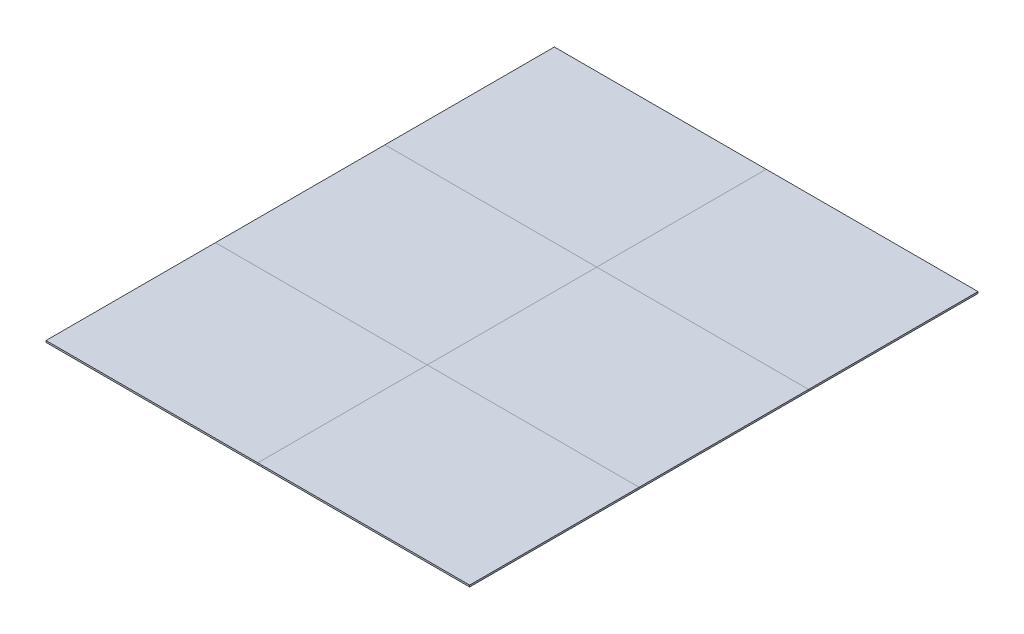
ISO-10303-21;
HEADER;
FILE_DESCRIPTION(('STEP AP214'),'2;1');
FILE_NAME('part.step','',(''),(''),'','','');
FILE_SCHEMA(('AUTOMOTIVE_DESIGN { 1 0 10303 214 1 1 1 1 }'));
ENDSEC;
DATA;
#1=APPLICATION_CONTEXT('core data for automotive mechanical design processes');
#2=APPLICATION_PROTOCOL_DEFINITION('international standard','automotive_design',2000,#1);
#3=PRODUCT_CONTEXT('',#1,'mechanical');
#4=PRODUCT('Part','Part','',(#3));
#5=PRODUCT_RELATED_PRODUCT_CATEGORY('part','',(#4));
#6=PRODUCT_DEFINITION_FORMATION('','',#4);
#7=PRODUCT_DEFINITION_CONTEXT('part definition',#1,'design');
#8=PRODUCT_DEFINITION('design','',#6,#7);
#9=PRODUCT_DEFINITION_SHAPE('','',#8);
#10=(LENGTH_UNIT() NAMED_UNIT(*) SI_UNIT(.MILLI.,.METRE.));
#11=(NAMED_UNIT(*) PLANE_ANGLE_UNIT() SI_UNIT($,.RADIAN.));
#12=(NAMED_UNIT(*) SI_UNIT($,.STERADIAN.) SOLID_ANGLE_UNIT());
#13=UNCERTAINTY_MEASURE_WITH_UNIT(LENGTH_MEASURE(1.E-05),#10,'distance_accuracy_value','');
#14=(GEOMETRIC_REPRESENTATION_CONTEXT(3) GLOBAL_UNCERTAINTY_ASSIGNED_CONTEXT((#13)) GLOBAL_UNIT_ASSIGNED_CONTEXT((#10,
#11,#12)) REPRESENTATION_CONTEXT('',''));
#15=CARTESIAN_POINT('',(0.,0.,0.));
#16=DIRECTION('',(0.,0.,1.));
#17=DIRECTION('',(1.,0.,0.));
#18=AXIS2_PLACEMENT_3D('',#15,#16,#17);
#19=CARTESIAN_POINT('',(2500.,-20.,-4000.));
#20=DIRECTION('',(-1.,0.,0.));
#21=DIRECTION('',(0.,0.,1.));
#22=AXIS2_PLACEMENT_3D('',#19,#20,#21);
#23=PLANE('',#22);
#24=DIRECTION('',(0.,0.,1.));
#25=VECTOR('',#24,1.);
#26=CARTESIAN_POINT('',(2500.,0.,-4000.));
#27=LINE('',#26,#25);
#28=CARTESIAN_POINT('',(2500.,0.,-6000.));
#29=VERTEX_POINT('',#28);
#30=CARTESIAN_POINT('',(2500.,0.,-4000.));
#31=VERTEX_POINT('',#30);
#32=EDGE_CURVE('E110',#29,#31,#27,.T.);
#33=ORIENTED_EDGE('',*,*,#32,.F.);
#34=DIRECTION('',(0.,1.,0.));
#35=VECTOR('',#34,1.);
#36=CARTESIAN_POINT('',(2500.,-20.,-6000.));
#37=LINE('',#36,#35);
#38=CARTESIAN_POINT('',(2500.,-20.,-6000.));
#39=VERTEX_POINT('',#38);
#40=EDGE_CURVE('E12',#39,#29,#37,.T.);
#41=ORIENTED_EDGE('',*,*,#40,.F.);
#42=DIRECTION('',(0.,0.,1.));
#43=VECTOR('',#42,1.);
#44=CARTESIAN_POINT('',(2500.,-20.,-4000.));
#45=LINE('',#44,#43);
#46=CARTESIAN_POINT('',(2500.,-20.,-4000.));
#47=VERTEX_POINT('',#46);
#48=EDGE_CURVE('E104',#39,#47,#45,.T.);
#49=ORIENTED_EDGE('',*,*,#48,.T.);
#50=DIRECTION('',(0.,1.,0.));
#51=VECTOR('',#50,1.);
#52=CARTESIAN_POINT('',(2500.,-20.,-4000.));
#53=LINE('',#52,#51);
#54=EDGE_CURVE('E49',#47,#31,#53,.T.);
#55=ORIENTED_EDGE('',*,*,#54,.T.);
#56=EDGE_LOOP('',(#33,#41,#49,#55));
#57=FACE_BOUND('',#56,.T.);
#58=ADVANCED_FACE('F46',(#57),#23,.T.);
#59=CARTESIAN_POINT('',(2500.,-20.,-6000.));
#60=DIRECTION('',(0.,0.,-1.));
#61=DIRECTION('',(-1.,0.,0.));
#62=AXIS2_PLACEMENT_3D('',#59,#60,#61);
#63=PLANE('',#62);
#64=DIRECTION('',(-1.,0.,0.));
#65=VECTOR('',#64,1.);
#66=CARTESIAN_POINT('',(2500.,0.,-6000.));
#67=LINE('',#66,#65);
#68=CARTESIAN_POINT('',(5000.,0.,-6000.));
#69=VERTEX_POINT('',#68);
#70=EDGE_CURVE('E106',#69,#29,#67,.T.);
#71=ORIENTED_EDGE('',*,*,#70,.F.);
#72=DIRECTION('',(0.,1.,0.));
#73=VECTOR('',#72,1.);
#74=CARTESIAN_POINT('',(5000.,-20.,-6000.));
#75=LINE('',#74,#73);
#76=CARTESIAN_POINT('',(5000.,-20.,-6000.));
#77=VERTEX_POINT('',#76);
#78=EDGE_CURVE('E55',#77,#69,#75,.T.);
#79=ORIENTED_EDGE('',*,*,#78,.F.);
#80=DIRECTION('',(-1.,0.,0.));
#81=VECTOR('',#80,1.);
#82=CARTESIAN_POINT('',(2500.,-20.,-6000.));
#83=LINE('',#82,#81);
#84=EDGE_CURVE('E101',#77,#39,#83,.T.);
#85=ORIENTED_EDGE('',*,*,#84,.T.);
#86=ORIENTED_EDGE('',*,*,#40,.T.);
#87=EDGE_LOOP('',(#71,#79,#85,#86));
#88=FACE_BOUND('',#87,.T.);
#89=ADVANCED_FACE('F120',(#88),#63,.T.);
#90=CARTESIAN_POINT('',(5000.,-20.,-4000.));
#91=DIRECTION('',(1.,0.,0.));
#92=DIRECTION('',(0.,0.,-1.));
#93=AXIS2_PLACEMENT_3D('',#90,#91,#92);
#94=PLANE('',#93);
#95=DIRECTION('',(0.,0.,-1.));
#96=VECTOR('',#95,1.);
#97=CARTESIAN_POINT('',(5000.,0.,-4000.));
#98=LINE('',#97,#96);
#99=CARTESIAN_POINT('',(5000.,0.,-4000.));
#100=VERTEX_POINT('',#99);
#101=EDGE_CURVE('E96',#100,#69,#98,.T.);
#102=ORIENTED_EDGE('',*,*,#101,.F.);
#103=DIRECTION('',(0.,1.,0.));
#104=VECTOR('',#103,1.);
#105=CARTESIAN_POINT('',(5000.,-20.,-4000.));
#106=LINE('',#105,#104);
#107=CARTESIAN_POINT('',(5000.,-20.,-4000.));
#108=VERTEX_POINT('',#107);
#109=EDGE_CURVE('E91',#108,#100,#106,.T.);
#110=ORIENTED_EDGE('',*,*,#109,.F.);
#111=DIRECTION('',(0.,0.,-1.));
#112=VECTOR('',#111,1.);
#113=CARTESIAN_POINT('',(5000.,-20.,-4000.));
#114=LINE('',#113,#112);
#115=EDGE_CURVE('E94',#108,#77,#114,.T.);
#116=ORIENTED_EDGE('',*,*,#115,.T.);
#117=ORIENTED_EDGE('',*,*,#78,.T.);
#118=EDGE_LOOP('',(#102,#110,#116,#117));
#119=FACE_BOUND('',#118,.T.);
#120=ADVANCED_FACE('F93',(#119),#94,.T.);
#121=CARTESIAN_POINT('',(2500.,-20.,-4000.));
#122=DIRECTION('',(0.,0.,1.));
#123=DIRECTION('',(1.,0.,0.));
#124=AXIS2_PLACEMENT_3D('',#121,#122,#123);
#125=PLANE('',#124);
#126=DIRECTION('',(1.,0.,0.));
#127=VECTOR('',#126,1.);
#128=CARTESIAN_POINT('',(2500.,0.,-4000.));
#129=LINE('',#128,#127);
#130=EDGE_CURVE('E113',#31,#100,#129,.T.);
#131=ORIENTED_EDGE('',*,*,#130,.F.);
#132=ORIENTED_EDGE('',*,*,#54,.F.);
#133=DIRECTION('',(1.,0.,0.));
#134=VECTOR('',#133,1.);
#135=CARTESIAN_POINT('',(2500.,-20.,-4000.));
#136=LINE('',#135,#134);
#137=EDGE_CURVE('E100',#47,#108,#136,.T.);
#138=ORIENTED_EDGE('',*,*,#137,.T.);
#139=ORIENTED_EDGE('',*,*,#109,.T.);
#140=EDGE_LOOP('',(#131,#132,#138,#139));
#141=FACE_BOUND('',#140,.T.);
#142=ADVANCED_FACE('F103',(#141),#125,.T.);
#143=CARTESIAN_POINT('',(2500.,-20.,-4000.));
#144=DIRECTION('',(0.,-1.,0.));
#145=DIRECTION('',(0.,0.,-1.));
#146=AXIS2_PLACEMENT_3D('',#143,#144,#145);
#147=PLANE('',#146);
#148=ORIENTED_EDGE('',*,*,#48,.F.);
#149=ORIENTED_EDGE('',*,*,#84,.F.);
#150=ORIENTED_EDGE('',*,*,#115,.F.);
#151=ORIENTED_EDGE('',*,*,#137,.F.);
#152=EDGE_LOOP('',(#148,#149,#150,#151));
#153=FACE_BOUND('',#152,.T.);
#154=ADVANCED_FACE('F99',(#153),#147,.T.);
#155=CARTESIAN_POINT('',(2500.,0.,-4000.));
#156=DIRECTION('',(0.,-1.,0.));
#157=DIRECTION('',(0.,0.,-1.));
#158=AXIS2_PLACEMENT_3D('',#155,#156,#157);
#159=PLANE('',#158);
#160=ORIENTED_EDGE('',*,*,#32,.T.);
#161=ORIENTED_EDGE('',*,*,#130,.T.);
#162=ORIENTED_EDGE('',*,*,#101,.T.);
#163=ORIENTED_EDGE('',*,*,#70,.T.);
#164=EDGE_LOOP('',(#160,#161,#162,#163));
#165=FACE_BOUND('',#164,.T.);
#166=ADVANCED_FACE('F119',(#165),#159,.F.);
#167=CLOSED_SHELL('',(#58,#89,#120,#142,#154,#166));
#168=MANIFOLD_SOLID_BREP('B2',#167);
#169=CARTESIAN_POINT('',(2500.,-20.,-2000.));
#170=DIRECTION('',(-1.,0.,0.));
#171=DIRECTION('',(0.,0.,1.));
#172=AXIS2_PLACEMENT_3D('',#169,#170,#171);
#173=PLANE('',#172);
#174=DIRECTION('',(0.,0.,1.));
#175=VECTOR('',#174,1.);
#176=CARTESIAN_POINT('',(2500.,0.,-2000.));
#177=LINE('',#176,#175);
#178=CARTESIAN_POINT('',(2500.,0.,-4000.));
#179=VERTEX_POINT('',#178);
#180=CARTESIAN_POINT('',(2500.,0.,-2000.));
#181=VERTEX_POINT('',#180);
#182=EDGE_CURVE('E244',#179,#181,#177,.T.);
#183=ORIENTED_EDGE('',*,*,#182,.F.);
#184=DIRECTION('',(0.,1.,0.));
#185=VECTOR('',#184,1.);
#186=CARTESIAN_POINT('',(2500.,-20.,-4000.));
#187=LINE('',#186,#185);
#188=CARTESIAN_POINT('',(2500.,-20.,-4000.));
#189=VERTEX_POINT('',#188);
#190=EDGE_CURVE('E44',#189,#179,#187,.T.);
#191=ORIENTED_EDGE('',*,*,#190,.F.);
#192=DIRECTION('',(0.,0.,1.));
#193=VECTOR('',#192,1.);
#194=CARTESIAN_POINT('',(2500.,-20.,-2000.));
#195=LINE('',#194,#193);
#196=CARTESIAN_POINT('',(2500.,-20.,-2000.));
#197=VERTEX_POINT('',#196);
#198=EDGE_CURVE('E238',#189,#197,#195,.T.);
#199=ORIENTED_EDGE('',*,*,#198,.T.);
#200=DIRECTION('',(0.,1.,0.));
#201=VECTOR('',#200,1.);
#202=CARTESIAN_POINT('',(2500.,-20.,-2000.));
#203=LINE('',#202,#201);
#204=EDGE_CURVE('E183',#197,#181,#203,.T.);
#205=ORIENTED_EDGE('',*,*,#204,.T.);
#206=EDGE_LOOP('',(#183,#191,#199,#205));
#207=FACE_BOUND('',#206,.T.);
#208=ADVANCED_FACE('F180',(#207),#173,.T.);
#209=CARTESIAN_POINT('',(2500.,-20.,-4000.));
#210=DIRECTION('',(0.,0.,-1.));
#211=DIRECTION('',(-1.,0.,0.));
#212=AXIS2_PLACEMENT_3D('',#209,#210,#211);
#213=PLANE('',#212);
#214=DIRECTION('',(-1.,0.,0.));
#215=VECTOR('',#214,1.);
#216=CARTESIAN_POINT('',(2500.,0.,-4000.));
#217=LINE('',#216,#215);
#218=CARTESIAN_POINT('',(5000.,0.,-4000.));
#219=VERTEX_POINT('',#218);
#220=EDGE_CURVE('E240',#219,#179,#217,.T.);
#221=ORIENTED_EDGE('',*,*,#220,.F.);
#222=DIRECTION('',(0.,1.,0.));
#223=VECTOR('',#222,1.);
#224=CARTESIAN_POINT('',(5000.,-20.,-4000.));
#225=LINE('',#224,#223);
#226=CARTESIAN_POINT('',(5000.,-20.,-4000.));
#227=VERTEX_POINT('',#226);
#228=EDGE_CURVE('E189',#227,#219,#225,.T.);
#229=ORIENTED_EDGE('',*,*,#228,.F.);
#230=DIRECTION('',(-1.,0.,0.));
#231=VECTOR('',#230,1.);
#232=CARTESIAN_POINT('',(2500.,-20.,-4000.));
#233=LINE('',#232,#231);
#234=EDGE_CURVE('E235',#227,#189,#233,.T.);
#235=ORIENTED_EDGE('',*,*,#234,.T.);
#236=ORIENTED_EDGE('',*,*,#190,.T.);
#237=EDGE_LOOP('',(#221,#229,#235,#236));
#238=FACE_BOUND('',#237,.T.);
#239=ADVANCED_FACE('F254',(#238),#213,.T.);
#240=CARTESIAN_POINT('',(5000.,-20.,-2000.));
#241=DIRECTION('',(1.,0.,0.));
#242=DIRECTION('',(0.,0.,-1.));
#243=AXIS2_PLACEMENT_3D('',#240,#241,#242);
#244=PLANE('',#243);
#245=DIRECTION('',(0.,0.,-1.));
#246=VECTOR('',#245,1.);
#247=CARTESIAN_POINT('',(5000.,0.,-2000.));
#248=LINE('',#247,#246);
#249=CARTESIAN_POINT('',(5000.,0.,-2000.));
#250=VERTEX_POINT('',#249);
#251=EDGE_CURVE('E230',#250,#219,#248,.T.);
#252=ORIENTED_EDGE('',*,*,#251,.F.);
#253=DIRECTION('',(0.,1.,0.));
#254=VECTOR('',#253,1.);
#255=CARTESIAN_POINT('',(5000.,-20.,-2000.));
#256=LINE('',#255,#254);
#257=CARTESIAN_POINT('',(5000.,-20.,-2000.));
#258=VERTEX_POINT('',#257);
#259=EDGE_CURVE('E225',#258,#250,#256,.T.);
#260=ORIENTED_EDGE('',*,*,#259,.F.);
#261=DIRECTION('',(0.,0.,-1.));
#262=VECTOR('',#261,1.);
#263=CARTESIAN_POINT('',(5000.,-20.,-2000.));
#264=LINE('',#263,#262);
#265=EDGE_CURVE('E228',#258,#227,#264,.T.);
#266=ORIENTED_EDGE('',*,*,#265,.T.);
#267=ORIENTED_EDGE('',*,*,#228,.T.);
#268=EDGE_LOOP('',(#252,#260,#266,#267));
#269=FACE_BOUND('',#268,.T.);
#270=ADVANCED_FACE('F227',(#269),#244,.T.);
#271=CARTESIAN_POINT('',(2500.,-20.,-2000.));
#272=DIRECTION('',(0.,0.,1.));
#273=DIRECTION('',(1.,0.,0.));
#274=AXIS2_PLACEMENT_3D('',#271,#272,#273);
#275=PLANE('',#274);
#276=DIRECTION('',(1.,0.,0.));
#277=VECTOR('',#276,1.);
#278=CARTESIAN_POINT('',(2500.,0.,-2000.));
#279=LINE('',#278,#277);
#280=EDGE_CURVE('E247',#181,#250,#279,.T.);
#281=ORIENTED_EDGE('',*,*,#280,.F.);
#282=ORIENTED_EDGE('',*,*,#204,.F.);
#283=DIRECTION('',(1.,0.,0.));
#284=VECTOR('',#283,1.);
#285=CARTESIAN_POINT('',(2500.,-20.,-2000.));
#286=LINE('',#285,#284);
#287=EDGE_CURVE('E234',#197,#258,#286,.T.);
#288=ORIENTED_EDGE('',*,*,#287,.T.);
#289=ORIENTED_EDGE('',*,*,#259,.T.);
#290=EDGE_LOOP('',(#281,#282,#288,#289));
#291=FACE_BOUND('',#290,.T.);
#292=ADVANCED_FACE('F237',(#291),#275,.T.);
#293=CARTESIAN_POINT('',(2500.,-20.,-2000.));
#294=DIRECTION('',(0.,-1.,0.));
#295=DIRECTION('',(0.,0.,-1.));
#296=AXIS2_PLACEMENT_3D('',#293,#294,#295);
#297=PLANE('',#296);
#298=ORIENTED_EDGE('',*,*,#198,.F.);
#299=ORIENTED_EDGE('',*,*,#234,.F.);
#300=ORIENTED_EDGE('',*,*,#265,.F.);
#301=ORIENTED_EDGE('',*,*,#287,.F.);
#302=EDGE_LOOP('',(#298,#299,#300,#301));
#303=FACE_BOUND('',#302,.T.);
#304=ADVANCED_FACE('F233',(#303),#297,.T.);
#305=CARTESIAN_POINT('',(2500.,0.,-2000.));
#306=DIRECTION('',(0.,-1.,0.));
#307=DIRECTION('',(0.,0.,-1.));
#308=AXIS2_PLACEMENT_3D('',#305,#306,#307);
#309=PLANE('',#308);
#310=ORIENTED_EDGE('',*,*,#182,.T.);
#311=ORIENTED_EDGE('',*,*,#280,.T.);
#312=ORIENTED_EDGE('',*,*,#251,.T.);
#313=ORIENTED_EDGE('',*,*,#220,.T.);
#314=EDGE_LOOP('',(#310,#311,#312,#313));
#315=FACE_BOUND('',#314,.T.);
#316=ADVANCED_FACE('F253',(#315),#309,.F.);
#317=CLOSED_SHELL('',(#208,#239,#270,#292,#304,#316));
#318=MANIFOLD_SOLID_BREP('B6',#317);
#319=CARTESIAN_POINT('',(2500.,-20.,0.));
#320=DIRECTION('',(-1.,0.,0.));
#321=DIRECTION('',(0.,0.,1.));
#322=AXIS2_PLACEMENT_3D('',#319,#320,#321);
#323=PLANE('',#322);
#324=DIRECTION('',(0.,0.,1.));
#325=VECTOR('',#324,1.);
#326=CARTESIAN_POINT('',(2500.,0.,0.));
#327=LINE('',#326,#325);
#328=CARTESIAN_POINT('',(2500.,0.,-2000.));
#329=VERTEX_POINT('',#328);
#330=CARTESIAN_POINT('',(2500.,0.,0.));
#331=VERTEX_POINT('',#330);
#332=EDGE_CURVE('E378',#329,#331,#327,.T.);
#333=ORIENTED_EDGE('',*,*,#332,.F.);
#334=DIRECTION('',(0.,1.,0.));
#335=VECTOR('',#334,1.);
#336=CARTESIAN_POINT('',(2500.,-20.,-2000.));
#337=LINE('',#336,#335);
#338=CARTESIAN_POINT('',(2500.,-20.,-2000.));
#339=VERTEX_POINT('',#338);
#340=EDGE_CURVE('E178',#339,#329,#337,.T.);
#341=ORIENTED_EDGE('',*,*,#340,.F.);
#342=DIRECTION('',(0.,0.,1.));
#343=VECTOR('',#342,1.);
#344=CARTESIAN_POINT('',(2500.,-20.,0.));
#345=LINE('',#344,#343);
#346=CARTESIAN_POINT('',(2500.,-20.,0.));
#347=VERTEX_POINT('',#346);
#348=EDGE_CURVE('E372',#339,#347,#345,.T.);
#349=ORIENTED_EDGE('',*,*,#348,.T.);
#350=DIRECTION('',(0.,1.,0.));
#351=VECTOR('',#350,1.);
#352=CARTESIAN_POINT('',(2500.,-20.,0.));
#353=LINE('',#352,#351);
#354=EDGE_CURVE('E317',#347,#331,#353,.T.);
#355=ORIENTED_EDGE('',*,*,#354,.T.);
#356=EDGE_LOOP('',(#333,#341,#349,#355));
#357=FACE_BOUND('',#356,.T.);
#358=ADVANCED_FACE('F314',(#357),#323,.T.);
#359=CARTESIAN_POINT('',(2500.,-20.,-2000.));
#360=DIRECTION('',(0.,0.,-1.));
#361=DIRECTION('',(-1.,0.,0.));
#362=AXIS2_PLACEMENT_3D('',#359,#360,#361);
#363=PLANE('',#362);
#364=DIRECTION('',(-1.,0.,0.));
#365=VECTOR('',#364,1.);
#366=CARTESIAN_POINT('',(2500.,0.,-2000.));
#367=LINE('',#366,#365);
#368=CARTESIAN_POINT('',(5000.,0.,-2000.));
#369=VERTEX_POINT('',#368);
#370=EDGE_CURVE('E374',#369,#329,#367,.T.);
#371=ORIENTED_EDGE('',*,*,#370,.F.);
#372=DIRECTION('',(0.,1.,0.));
#373=VECTOR('',#372,1.);
#374=CARTESIAN_POINT('',(5000.,-20.,-2000.));
#375=LINE('',#374,#373);
#376=CARTESIAN_POINT('',(5000.,-20.,-2000.));
#377=VERTEX_POINT('',#376);
#378=EDGE_CURVE('E323',#377,#369,#375,.T.);
#379=ORIENTED_EDGE('',*,*,#378,.F.);
#380=DIRECTION('',(-1.,0.,0.));
#381=VECTOR('',#380,1.);
#382=CARTESIAN_POINT('',(2500.,-20.,-2000.));
#383=LINE('',#382,#381);
#384=EDGE_CURVE('E369',#377,#339,#383,.T.);
#385=ORIENTED_EDGE('',*,*,#384,.T.);
#386=ORIENTED_EDGE('',*,*,#340,.T.);
#387=EDGE_LOOP('',(#371,#379,#385,#386));
#388=FACE_BOUND('',#387,.T.);
#389=ADVANCED_FACE('F388',(#388),#363,.T.);
#390=CARTESIAN_POINT('',(5000.,-20.,0.));
#391=DIRECTION('',(1.,0.,0.));
#392=DIRECTION('',(0.,0.,-1.));
#393=AXIS2_PLACEMENT_3D('',#390,#391,#392);
#394=PLANE('',#393);
#395=DIRECTION('',(0.,0.,-1.));
#396=VECTOR('',#395,1.);
#397=CARTESIAN_POINT('',(5000.,0.,0.));
#398=LINE('',#397,#396);
#399=CARTESIAN_POINT('',(5000.,0.,0.));
#400=VERTEX_POINT('',#399);
#401=EDGE_CURVE('E364',#400,#369,#398,.T.);
#402=ORIENTED_EDGE('',*,*,#401,.F.);
#403=DIRECTION('',(0.,1.,0.));
#404=VECTOR('',#403,1.);
#405=CARTESIAN_POINT('',(5000.,-20.,0.));
#406=LINE('',#405,#404);
#407=CARTESIAN_POINT('',(5000.,-20.,0.));
#408=VERTEX_POINT('',#407);
#409=EDGE_CURVE('E359',#408,#400,#406,.T.);
#410=ORIENTED_EDGE('',*,*,#409,.F.);
#411=DIRECTION('',(0.,0.,-1.));
#412=VECTOR('',#411,1.);
#413=CARTESIAN_POINT('',(5000.,-20.,0.));
#414=LINE('',#413,#412);
#415=EDGE_CURVE('E362',#408,#377,#414,.T.);
#416=ORIENTED_EDGE('',*,*,#415,.T.);
#417=ORIENTED_EDGE('',*,*,#378,.T.);
#418=EDGE_LOOP('',(#402,#410,#416,#417));
#419=FACE_BOUND('',#418,.T.);
#420=ADVANCED_FACE('F361',(#419),#394,.T.);
#421=CARTESIAN_POINT('',(2500.,-20.,0.));
#422=DIRECTION('',(0.,0.,1.));
#423=DIRECTION('',(1.,0.,0.));
#424=AXIS2_PLACEMENT_3D('',#421,#422,#423);
#425=PLANE('',#424);
#426=DIRECTION('',(1.,0.,0.));
#427=VECTOR('',#426,1.);
#428=CARTESIAN_POINT('',(2500.,0.,0.));
#429=LINE('',#428,#427);
#430=EDGE_CURVE('E381',#331,#400,#429,.T.);
#431=ORIENTED_EDGE('',*,*,#430,.F.);
#432=ORIENTED_EDGE('',*,*,#354,.F.);
#433=DIRECTION('',(1.,0.,0.));
#434=VECTOR('',#433,1.);
#435=CARTESIAN_POINT('',(2500.,-20.,0.));
#436=LINE('',#435,#434);
#437=EDGE_CURVE('E368',#347,#408,#436,.T.);
#438=ORIENTED_EDGE('',*,*,#437,.T.);
#439=ORIENTED_EDGE('',*,*,#409,.T.);
#440=EDGE_LOOP('',(#431,#432,#438,#439));
#441=FACE_BOUND('',#440,.T.);
#442=ADVANCED_FACE('F371',(#441),#425,.T.);
#443=CARTESIAN_POINT('',(2500.,-20.,0.));
#444=DIRECTION('',(0.,-1.,0.));
#445=DIRECTION('',(0.,0.,-1.));
#446=AXIS2_PLACEMENT_3D('',#443,#444,#445);
#447=PLANE('',#446);
#448=ORIENTED_EDGE('',*,*,#348,.F.);
#449=ORIENTED_EDGE('',*,*,#384,.F.);
#450=ORIENTED_EDGE('',*,*,#415,.F.);
#451=ORIENTED_EDGE('',*,*,#437,.F.);
#452=EDGE_LOOP('',(#448,#449,#450,#451));
#453=FACE_BOUND('',#452,.T.);
#454=ADVANCED_FACE('F367',(#453),#447,.T.);
#455=CARTESIAN_POINT('',(2500.,0.,0.));
#456=DIRECTION('',(0.,-1.,0.));
#457=DIRECTION('',(0.,0.,-1.));
#458=AXIS2_PLACEMENT_3D('',#455,#456,#457);
#459=PLANE('',#458);
#460=ORIENTED_EDGE('',*,*,#332,.T.);
#461=ORIENTED_EDGE('',*,*,#430,.T.);
#462=ORIENTED_EDGE('',*,*,#401,.T.);
#463=ORIENTED_EDGE('',*,*,#370,.T.);
#464=EDGE_LOOP('',(#460,#461,#462,#463));
#465=FACE_BOUND('',#464,.T.);
#466=ADVANCED_FACE('F387',(#465),#459,.F.);
#467=CLOSED_SHELL('',(#358,#389,#420,#442,#454,#466));
#468=MANIFOLD_SOLID_BREP('B38',#467);
#469=CARTESIAN_POINT('',(0.,-20.,-4000.));
#470=DIRECTION('',(-1.,0.,0.));
#471=DIRECTION('',(0.,0.,1.));
#472=AXIS2_PLACEMENT_3D('',#469,#470,#471);
#473=PLANE('',#472);
#474=DIRECTION('',(0.,0.,1.));
#475=VECTOR('',#474,1.);
#476=CARTESIAN_POINT('',(0.,0.,-4000.));
#477=LINE('',#476,#475);
#478=CARTESIAN_POINT('',(0.,0.,-6000.));
#479=VERTEX_POINT('',#478);
#480=CARTESIAN_POINT('',(0.,0.,-4000.));
#481=VERTEX_POINT('',#480);
#482=EDGE_CURVE('E512',#479,#481,#477,.T.);
#483=ORIENTED_EDGE('',*,*,#482,.F.);
#484=DIRECTION('',(0.,1.,0.));
#485=VECTOR('',#484,1.);
#486=CARTESIAN_POINT('',(0.,-20.,-6000.));
#487=LINE('',#486,#485);
#488=CARTESIAN_POINT('',(0.,-20.,-6000.));
#489=VERTEX_POINT('',#488);
#490=EDGE_CURVE('E312',#489,#479,#487,.T.);
#491=ORIENTED_EDGE('',*,*,#490,.F.);
#492=DIRECTION('',(0.,0.,1.));
#493=VECTOR('',#492,1.);
#494=CARTESIAN_POINT('',(0.,-20.,-4000.));
#495=LINE('',#494,#493);
#496=CARTESIAN_POINT('',(0.,-20.,-4000.));
#497=VERTEX_POINT('',#496);
#498=EDGE_CURVE('E506',#489,#497,#495,.T.);
#499=ORIENTED_EDGE('',*,*,#498,.T.);
#500=DIRECTION('',(0.,1.,0.));
#501=VECTOR('',#500,1.);
#502=CARTESIAN_POINT('',(0.,-20.,-4000.));
#503=LINE('',#502,#501);
#504=EDGE_CURVE('E451',#497,#481,#503,.T.);
#505=ORIENTED_EDGE('',*,*,#504,.T.);
#506=EDGE_LOOP('',(#483,#491,#499,#505));
#507=FACE_BOUND('',#506,.T.);
#508=ADVANCED_FACE('F448',(#507),#473,.T.);
#509=CARTESIAN_POINT('',(0.,-20.,-6000.));
#510=DIRECTION('',(0.,0.,-1.));
#511=DIRECTION('',(-1.,0.,0.));
#512=AXIS2_PLACEMENT_3D('',#509,#510,#511);
#513=PLANE('',#512);
#514=DIRECTION('',(-1.,0.,0.));
#515=VECTOR('',#514,1.);
#516=CARTESIAN_POINT('',(0.,0.,-6000.));
#517=LINE('',#516,#515);
#518=CARTESIAN_POINT('',(2500.,0.,-6000.));
#519=VERTEX_POINT('',#518);
#520=EDGE_CURVE('E508',#519,#479,#517,.T.);
#521=ORIENTED_EDGE('',*,*,#520,.F.);
#522=DIRECTION('',(0.,1.,0.));
#523=VECTOR('',#522,1.);
#524=CARTESIAN_POINT('',(2500.,-20.,-6000.));
#525=LINE('',#524,#523);
#526=CARTESIAN_POINT('',(2500.,-20.,-6000.));
#527=VERTEX_POINT('',#526);
#528=EDGE_CURVE('E457',#527,#519,#525,.T.);
#529=ORIENTED_EDGE('',*,*,#528,.F.);
#530=DIRECTION('',(-1.,0.,0.));
#531=VECTOR('',#530,1.);
#532=CARTESIAN_POINT('',(0.,-20.,-6000.));
#533=LINE('',#532,#531);
#534=EDGE_CURVE('E503',#527,#489,#533,.T.);
#535=ORIENTED_EDGE('',*,*,#534,.T.);
#536=ORIENTED_EDGE('',*,*,#490,.T.);
#537=EDGE_LOOP('',(#521,#529,#535,#536));
#538=FACE_BOUND('',#537,.T.);
#539=ADVANCED_FACE('F522',(#538),#513,.T.);
#540=CARTESIAN_POINT('',(2500.,-20.,-4000.));
#541=DIRECTION('',(1.,0.,0.));
#542=DIRECTION('',(0.,0.,-1.));
#543=AXIS2_PLACEMENT_3D('',#540,#541,#542);
#544=PLANE('',#543);
#545=DIRECTION('',(0.,0.,-1.));
#546=VECTOR('',#545,1.);
#547=CARTESIAN_POINT('',(2500.,0.,-4000.));
#548=LINE('',#547,#546);
#549=CARTESIAN_POINT('',(2500.,0.,-4000.));
#550=VERTEX_POINT('',#549);
#551=EDGE_CURVE('E498',#550,#519,#548,.T.);
#552=ORIENTED_EDGE('',*,*,#551,.F.);
#553=DIRECTION('',(0.,1.,0.));
#554=VECTOR('',#553,1.);
#555=CARTESIAN_POINT('',(2500.,-20.,-4000.));
#556=LINE('',#555,#554);
#557=CARTESIAN_POINT('',(2500.,-20.,-4000.));
#558=VERTEX_POINT('',#557);
#559=EDGE_CURVE('E493',#558,#550,#556,.T.);
#560=ORIENTED_EDGE('',*,*,#559,.F.);
#561=DIRECTION('',(0.,0.,-1.));
#562=VECTOR('',#561,1.);
#563=CARTESIAN_POINT('',(2500.,-20.,-4000.));
#564=LINE('',#563,#562);
#565=EDGE_CURVE('E496',#558,#527,#564,.T.);
#566=ORIENTED_EDGE('',*,*,#565,.T.);
#567=ORIENTED_EDGE('',*,*,#528,.T.);
#568=EDGE_LOOP('',(#552,#560,#566,#567));
#569=FACE_BOUND('',#568,.T.);
#570=ADVANCED_FACE('F495',(#569),#544,.T.);
#571=CARTESIAN_POINT('',(0.,-20.,-4000.));
#572=DIRECTION('',(0.,0.,1.));
#573=DIRECTION('',(1.,0.,0.));
#574=AXIS2_PLACEMENT_3D('',#571,#572,#573);
#575=PLANE('',#574);
#576=DIRECTION('',(1.,0.,0.));
#577=VECTOR('',#576,1.);
#578=CARTESIAN_POINT('',(0.,0.,-4000.));
#579=LINE('',#578,#577);
#580=EDGE_CURVE('E515',#481,#550,#579,.T.);
#581=ORIENTED_EDGE('',*,*,#580,.F.);
#582=ORIENTED_EDGE('',*,*,#504,.F.);
#583=DIRECTION('',(1.,0.,0.));
#584=VECTOR('',#583,1.);
#585=CARTESIAN_POINT('',(0.,-20.,-4000.));
#586=LINE('',#585,#584);
#587=EDGE_CURVE('E502',#497,#558,#586,.T.);
#588=ORIENTED_EDGE('',*,*,#587,.T.);
#589=ORIENTED_EDGE('',*,*,#559,.T.);
#590=EDGE_LOOP('',(#581,#582,#588,#589));
#591=FACE_BOUND('',#590,.T.);
#592=ADVANCED_FACE('F505',(#591),#575,.T.);
#593=CARTESIAN_POINT('',(0.,-20.,-4000.));
#594=DIRECTION('',(0.,-1.,0.));
#595=DIRECTION('',(0.,0.,-1.));
#596=AXIS2_PLACEMENT_3D('',#593,#594,#595);
#597=PLANE('',#596);
#598=ORIENTED_EDGE('',*,*,#498,.F.);
#599=ORIENTED_EDGE('',*,*,#534,.F.);
#600=ORIENTED_EDGE('',*,*,#565,.F.);
#601=ORIENTED_EDGE('',*,*,#587,.F.);
#602=EDGE_LOOP('',(#598,#599,#600,#601));
#603=FACE_BOUND('',#602,.T.);
#604=ADVANCED_FACE('F501',(#603),#597,.T.);
#605=CARTESIAN_POINT('',(0.,0.,-4000.));
#606=DIRECTION('',(0.,-1.,0.));
#607=DIRECTION('',(0.,0.,-1.));
#608=AXIS2_PLACEMENT_3D('',#605,#606,#607);
#609=PLANE('',#608);
#610=ORIENTED_EDGE('',*,*,#482,.T.);
#611=ORIENTED_EDGE('',*,*,#580,.T.);
#612=ORIENTED_EDGE('',*,*,#551,.T.);
#613=ORIENTED_EDGE('',*,*,#520,.T.);
#614=EDGE_LOOP('',(#610,#611,#612,#613));
#615=FACE_BOUND('',#614,.T.);
#616=ADVANCED_FACE('F521',(#615),#609,.F.);
#617=CLOSED_SHELL('',(#508,#539,#570,#592,#604,#616));
#618=MANIFOLD_SOLID_BREP('B172',#617);
#619=CARTESIAN_POINT('',(0.,-20.,-2000.));
#620=DIRECTION('',(-1.,0.,0.));
#621=DIRECTION('',(0.,0.,1.));
#622=AXIS2_PLACEMENT_3D('',#619,#620,#621);
#623=PLANE('',#622);
#624=DIRECTION('',(0.,0.,1.));
#625=VECTOR('',#624,1.);
#626=CARTESIAN_POINT('',(0.,0.,-2000.));
#627=LINE('',#626,#625);
#628=CARTESIAN_POINT('',(0.,0.,-4000.));
#629=VERTEX_POINT('',#628);
#630=CARTESIAN_POINT('',(0.,0.,-2000.));
#631=VERTEX_POINT('',#630);
#632=EDGE_CURVE('E645',#629,#631,#627,.T.);
#633=ORIENTED_EDGE('',*,*,#632,.F.);
#634=DIRECTION('',(0.,1.,0.));
#635=VECTOR('',#634,1.);
#636=CARTESIAN_POINT('',(0.,-20.,-4000.));
#637=LINE('',#636,#635);
#638=CARTESIAN_POINT('',(0.,-20.,-4000.));
#639=VERTEX_POINT('',#638);
#640=EDGE_CURVE('E446',#639,#629,#637,.T.);
#641=ORIENTED_EDGE('',*,*,#640,.F.);
#642=DIRECTION('',(0.,0.,1.));
#643=VECTOR('',#642,1.);
#644=CARTESIAN_POINT('',(0.,-20.,-2000.));
#645=LINE('',#644,#643);
#646=CARTESIAN_POINT('',(0.,-20.,-2000.));
#647=VERTEX_POINT('',#646);
#648=EDGE_CURVE('E639',#639,#647,#645,.T.);
#649=ORIENTED_EDGE('',*,*,#648,.T.);
#650=DIRECTION('',(0.,1.,0.));
#651=VECTOR('',#650,1.);
#652=CARTESIAN_POINT('',(0.,-20.,-2000.));
#653=LINE('',#652,#651);
#654=EDGE_CURVE('E584',#647,#631,#653,.T.);
#655=ORIENTED_EDGE('',*,*,#654,.T.);
#656=EDGE_LOOP('',(#633,#641,#649,#655));
#657=FACE_BOUND('',#656,.T.);
#658=ADVANCED_FACE('F581',(#657),#623,.T.);
#659=CARTESIAN_POINT('',(0.,-20.,-4000.));
#660=DIRECTION('',(0.,0.,-1.));
#661=DIRECTION('',(-1.,0.,0.));
#662=AXIS2_PLACEMENT_3D('',#659,#660,#661);
#663=PLANE('',#662);
#664=DIRECTION('',(-1.,0.,0.));
#665=VECTOR('',#664,1.);
#666=CARTESIAN_POINT('',(0.,0.,-4000.));
#667=LINE('',#666,#665);
#668=CARTESIAN_POINT('',(2500.,0.,-4000.));
#669=VERTEX_POINT('',#668);
#670=EDGE_CURVE('E641',#669,#629,#667,.T.);
#671=ORIENTED_EDGE('',*,*,#670,.F.);
#672=DIRECTION('',(0.,1.,0.));
#673=VECTOR('',#672,1.);
#674=CARTESIAN_POINT('',(2500.,-20.,-4000.));
#675=LINE('',#674,#673);
#676=CARTESIAN_POINT('',(2500.,-20.,-4000.));
#677=VERTEX_POINT('',#676);
#678=EDGE_CURVE('E590',#677,#669,#675,.T.);
#679=ORIENTED_EDGE('',*,*,#678,.F.);
#680=DIRECTION('',(-1.,0.,0.));
#681=VECTOR('',#680,1.);
#682=CARTESIAN_POINT('',(0.,-20.,-4000.));
#683=LINE('',#682,#681);
#684=EDGE_CURVE('E636',#677,#639,#683,.T.);
#685=ORIENTED_EDGE('',*,*,#684,.T.);
#686=ORIENTED_EDGE('',*,*,#640,.T.);
#687=EDGE_LOOP('',(#671,#679,#685,#686));
#688=FACE_BOUND('',#687,.T.);
#689=ADVANCED_FACE('F655',(#688),#663,.T.);
#690=CARTESIAN_POINT('',(2500.,-20.,-2000.));
#691=DIRECTION('',(1.,0.,0.));
#692=DIRECTION('',(0.,0.,-1.));
#693=AXIS2_PLACEMENT_3D('',#690,#691,#692);
#694=PLANE('',#693);
#695=DIRECTION('',(0.,0.,-1.));
#696=VECTOR('',#695,1.);
#697=CARTESIAN_POINT('',(2500.,0.,-2000.));
#698=LINE('',#697,#696);
#699=CARTESIAN_POINT('',(2500.,0.,-2000.));
#700=VERTEX_POINT('',#699);
#701=EDGE_CURVE('E631',#700,#669,#698,.T.);
#702=ORIENTED_EDGE('',*,*,#701,.F.);
#703=DIRECTION('',(0.,1.,0.));
#704=VECTOR('',#703,1.);
#705=CARTESIAN_POINT('',(2500.,-20.,-2000.));
#706=LINE('',#705,#704);
#707=CARTESIAN_POINT('',(2500.,-20.,-2000.));
#708=VERTEX_POINT('',#707);
#709=EDGE_CURVE('E626',#708,#700,#706,.T.);
#710=ORIENTED_EDGE('',*,*,#709,.F.);
#711=DIRECTION('',(0.,0.,-1.));
#712=VECTOR('',#711,1.);
#713=CARTESIAN_POINT('',(2500.,-20.,-2000.));
#714=LINE('',#713,#712);
#715=EDGE_CURVE('E629',#708,#677,#714,.T.);
#716=ORIENTED_EDGE('',*,*,#715,.T.);
#717=ORIENTED_EDGE('',*,*,#678,.T.);
#718=EDGE_LOOP('',(#702,#710,#716,#717));
#719=FACE_BOUND('',#718,.T.);
#720=ADVANCED_FACE('F628',(#719),#694,.T.);
#721=CARTESIAN_POINT('',(0.,-20.,-2000.));
#722=DIRECTION('',(0.,0.,1.));
#723=DIRECTION('',(1.,0.,0.));
#724=AXIS2_PLACEMENT_3D('',#721,#722,#723);
#725=PLANE('',#724);
#726=DIRECTION('',(1.,0.,0.));
#727=VECTOR('',#726,1.);
#728=CARTESIAN_POINT('',(0.,0.,-2000.));
#729=LINE('',#728,#727);
#730=EDGE_CURVE('E648',#631,#700,#729,.T.);
#731=ORIENTED_EDGE('',*,*,#730,.F.);
#732=ORIENTED_EDGE('',*,*,#654,.F.);
#733=DIRECTION('',(1.,0.,0.));
#734=VECTOR('',#733,1.);
#735=CARTESIAN_POINT('',(0.,-20.,-2000.));
#736=LINE('',#735,#734);
#737=EDGE_CURVE('E635',#647,#708,#736,.T.);
#738=ORIENTED_EDGE('',*,*,#737,.T.);
#739=ORIENTED_EDGE('',*,*,#709,.T.);
#740=EDGE_LOOP('',(#731,#732,#738,#739));
#741=FACE_BOUND('',#740,.T.);
#742=ADVANCED_FACE('F638',(#741),#725,.T.);
#743=CARTESIAN_POINT('',(0.,-20.,-2000.));
#744=DIRECTION('',(0.,-1.,0.));
#745=DIRECTION('',(0.,0.,-1.));
#746=AXIS2_PLACEMENT_3D('',#743,#744,#745);
#747=PLANE('',#746);
#748=ORIENTED_EDGE('',*,*,#648,.F.);
#749=ORIENTED_EDGE('',*,*,#684,.F.);
#750=ORIENTED_EDGE('',*,*,#715,.F.);
#751=ORIENTED_EDGE('',*,*,#737,.F.);
#752=EDGE_LOOP('',(#748,#749,#750,#751));
#753=FACE_BOUND('',#752,.T.);
#754=ADVANCED_FACE('F634',(#753),#747,.T.);
#755=CARTESIAN_POINT('',(0.,0.,-2000.));
#756=DIRECTION('',(0.,-1.,0.));
#757=DIRECTION('',(0.,0.,-1.));
#758=AXIS2_PLACEMENT_3D('',#755,#756,#757);
#759=PLANE('',#758);
#760=ORIENTED_EDGE('',*,*,#632,.T.);
#761=ORIENTED_EDGE('',*,*,#730,.T.);
#762=ORIENTED_EDGE('',*,*,#701,.T.);
#763=ORIENTED_EDGE('',*,*,#670,.T.);
#764=EDGE_LOOP('',(#760,#761,#762,#763));
#765=FACE_BOUND('',#764,.T.);
#766=ADVANCED_FACE('F654',(#765),#759,.F.);
#767=CLOSED_SHELL('',(#658,#689,#720,#742,#754,#766));
#768=MANIFOLD_SOLID_BREP('B306',#767);
#769=CARTESIAN_POINT('',(0.,-20.,0.));
#770=DIRECTION('',(-1.,0.,0.));
#771=DIRECTION('',(0.,0.,1.));
#772=AXIS2_PLACEMENT_3D('',#769,#770,#771);
#773=PLANE('',#772);
#774=DIRECTION('',(0.,0.,1.));
#775=VECTOR('',#774,1.);
#776=CARTESIAN_POINT('',(0.,0.,0.));
#777=LINE('',#776,#775);
#778=CARTESIAN_POINT('',(0.,0.,-2000.));
#779=VERTEX_POINT('',#778);
#780=CARTESIAN_POINT('',(0.,0.,0.));
#781=VERTEX_POINT('',#780);
#782=EDGE_CURVE('E769',#779,#781,#777,.T.);
#783=ORIENTED_EDGE('',*,*,#782,.F.);
#784=DIRECTION('',(0.,1.,0.));
#785=VECTOR('',#784,1.);
#786=CARTESIAN_POINT('',(0.,-20.,-2000.));
#787=LINE('',#786,#785);
#788=CARTESIAN_POINT('',(0.,-20.,-2000.));
#789=VERTEX_POINT('',#788);
#790=EDGE_CURVE('E579',#789,#779,#787,.T.);
#791=ORIENTED_EDGE('',*,*,#790,.F.);
#792=DIRECTION('',(0.,0.,1.));
#793=VECTOR('',#792,1.);
#794=CARTESIAN_POINT('',(0.,-20.,0.));
#795=LINE('',#794,#793);
#796=CARTESIAN_POINT('',(0.,-20.,0.));
#797=VERTEX_POINT('',#796);
#798=EDGE_CURVE('E763',#789,#797,#795,.T.);
#799=ORIENTED_EDGE('',*,*,#798,.T.);
#800=DIRECTION('',(0.,1.,0.));
#801=VECTOR('',#800,1.);
#802=CARTESIAN_POINT('',(0.,-20.,0.));
#803=LINE('',#802,#801);
#804=EDGE_CURVE('E708',#797,#781,#803,.T.);
#805=ORIENTED_EDGE('',*,*,#804,.T.);
#806=EDGE_LOOP('',(#783,#791,#799,#805));
#807=FACE_BOUND('',#806,.T.);
#808=ADVANCED_FACE('F705',(#807),#773,.T.);
#809=CARTESIAN_POINT('',(0.,-20.,-2000.));
#810=DIRECTION('',(0.,0.,-1.));
#811=DIRECTION('',(-1.,0.,0.));
#812=AXIS2_PLACEMENT_3D('',#809,#810,#811);
#813=PLANE('',#812);
#814=DIRECTION('',(-1.,0.,0.));
#815=VECTOR('',#814,1.);
#816=CARTESIAN_POINT('',(0.,0.,-2000.));
#817=LINE('',#816,#815);
#818=CARTESIAN_POINT('',(2500.,0.,-2000.));
#819=VERTEX_POINT('',#818);
#820=EDGE_CURVE('E765',#819,#779,#817,.T.);
#821=ORIENTED_EDGE('',*,*,#820,.F.);
#822=DIRECTION('',(0.,1.,0.));
#823=VECTOR('',#822,1.);
#824=CARTESIAN_POINT('',(2500.,-20.,-2000.));
#825=LINE('',#824,#823);
#826=CARTESIAN_POINT('',(2500.,-20.,-2000.));
#827=VERTEX_POINT('',#826);
#828=EDGE_CURVE('E714',#827,#819,#825,.T.);
#829=ORIENTED_EDGE('',*,*,#828,.F.);
#830=DIRECTION('',(-1.,0.,0.));
#831=VECTOR('',#830,1.);
#832=CARTESIAN_POINT('',(0.,-20.,-2000.));
#833=LINE('',#832,#831);
#834=EDGE_CURVE('E760',#827,#789,#833,.T.);
#835=ORIENTED_EDGE('',*,*,#834,.T.);
#836=ORIENTED_EDGE('',*,*,#790,.T.);
#837=EDGE_LOOP('',(#821,#829,#835,#836));
#838=FACE_BOUND('',#837,.T.);
#839=ADVANCED_FACE('F779',(#838),#813,.T.);
#840=CARTESIAN_POINT('',(2500.,-20.,0.));
#841=DIRECTION('',(1.,0.,0.));
#842=DIRECTION('',(0.,0.,-1.));
#843=AXIS2_PLACEMENT_3D('',#840,#841,#842);
#844=PLANE('',#843);
#845=DIRECTION('',(0.,0.,-1.));
#846=VECTOR('',#845,1.);
#847=CARTESIAN_POINT('',(2500.,0.,0.));
#848=LINE('',#847,#846);
#849=CARTESIAN_POINT('',(2500.,0.,0.));
#850=VERTEX_POINT('',#849);
#851=EDGE_CURVE('E755',#850,#819,#848,.T.);
#852=ORIENTED_EDGE('',*,*,#851,.F.);
#853=DIRECTION('',(0.,1.,0.));
#854=VECTOR('',#853,1.);
#855=CARTESIAN_POINT('',(2500.,-20.,0.));
#856=LINE('',#855,#854);
#857=CARTESIAN_POINT('',(2500.,-20.,0.));
#858=VERTEX_POINT('',#857);
#859=EDGE_CURVE('E750',#858,#850,#856,.T.);
#860=ORIENTED_EDGE('',*,*,#859,.F.);
#861=DIRECTION('',(0.,0.,-1.));
#862=VECTOR('',#861,1.);
#863=CARTESIAN_POINT('',(2500.,-20.,0.));
#864=LINE('',#863,#862);
#865=EDGE_CURVE('E753',#858,#827,#864,.T.);
#866=ORIENTED_EDGE('',*,*,#865,.T.);
#867=ORIENTED_EDGE('',*,*,#828,.T.);
#868=EDGE_LOOP('',(#852,#860,#866,#867));
#869=FACE_BOUND('',#868,.T.);
#870=ADVANCED_FACE('F752',(#869),#844,.T.);
#871=CARTESIAN_POINT('',(0.,-20.,0.));
#872=DIRECTION('',(0.,0.,1.));
#873=DIRECTION('',(1.,0.,0.));
#874=AXIS2_PLACEMENT_3D('',#871,#872,#873);
#875=PLANE('',#874);
#876=DIRECTION('',(1.,0.,0.));
#877=VECTOR('',#876,1.);
#878=CARTESIAN_POINT('',(0.,0.,0.));
#879=LINE('',#878,#877);
#880=EDGE_CURVE('E772',#781,#850,#879,.T.);
#881=ORIENTED_EDGE('',*,*,#880,.F.);
#882=ORIENTED_EDGE('',*,*,#804,.F.);
#883=DIRECTION('',(1.,0.,0.));
#884=VECTOR('',#883,1.);
#885=CARTESIAN_POINT('',(0.,-20.,0.));
#886=LINE('',#885,#884);
#887=EDGE_CURVE('E759',#797,#858,#886,.T.);
#888=ORIENTED_EDGE('',*,*,#887,.T.);
#889=ORIENTED_EDGE('',*,*,#859,.T.);
#890=EDGE_LOOP('',(#881,#882,#888,#889));
#891=FACE_BOUND('',#890,.T.);
#892=ADVANCED_FACE('F762',(#891),#875,.T.);
#893=CARTESIAN_POINT('',(0.,-20.,0.));
#894=DIRECTION('',(0.,-1.,0.));
#895=DIRECTION('',(0.,0.,-1.));
#896=AXIS2_PLACEMENT_3D('',#893,#894,#895);
#897=PLANE('',#896);
#898=ORIENTED_EDGE('',*,*,#798,.F.);
#899=ORIENTED_EDGE('',*,*,#834,.F.);
#900=ORIENTED_EDGE('',*,*,#865,.F.);
#901=ORIENTED_EDGE('',*,*,#887,.F.);
#902=EDGE_LOOP('',(#898,#899,#900,#901));
#903=FACE_BOUND('',#902,.T.);
#904=ADVANCED_FACE('F758',(#903),#897,.T.);
#905=CARTESIAN_POINT('',(0.,0.,0.));
#906=DIRECTION('',(0.,-1.,0.));
#907=DIRECTION('',(0.,0.,-1.));
#908=AXIS2_PLACEMENT_3D('',#905,#906,#907);
#909=PLANE('',#908);
#910=ORIENTED_EDGE('',*,*,#782,.T.);
#911=ORIENTED_EDGE('',*,*,#880,.T.);
#912=ORIENTED_EDGE('',*,*,#851,.T.);
#913=ORIENTED_EDGE('',*,*,#820,.T.);
#914=EDGE_LOOP('',(#910,#911,#912,#913));
#915=FACE_BOUND('',#914,.T.);
#916=ADVANCED_FACE('F778',(#915),#909,.F.);
#917=CLOSED_SHELL('',(#808,#839,#870,#892,#904,#916));
#918=MANIFOLD_SOLID_BREP('B440',#917);
#919=ADVANCED_BREP_SHAPE_REPRESENTATION('',(#18,#168,#318,#468,#618,#768,#918),#14);
#920=SHAPE_DEFINITION_REPRESENTATION(#9,#919);
ENDSEC;
END-ISO-10303-21;
